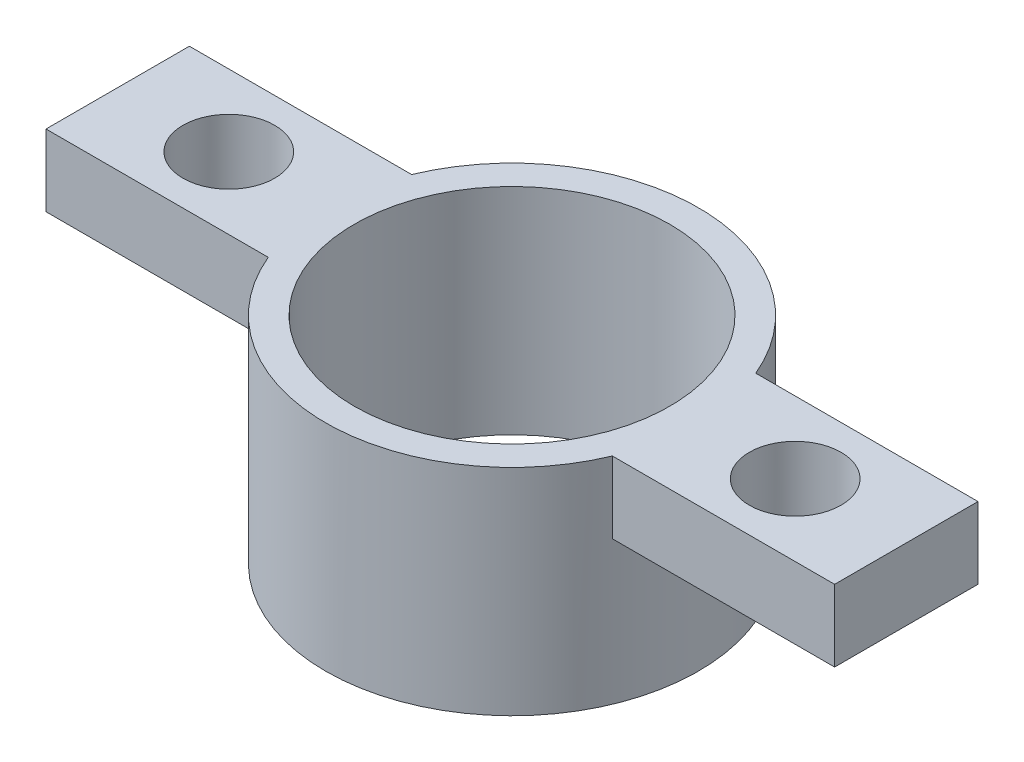
ISO-10303-21;
HEADER;
FILE_DESCRIPTION(('STEP AP214'),'2;1');
FILE_NAME('part.step','',(''),(''),'','','');
FILE_SCHEMA(('AUTOMOTIVE_DESIGN { 1 0 10303 214 1 1 1 1 }'));
ENDSEC;
DATA;
#1=APPLICATION_CONTEXT('core data for automotive mechanical design processes');
#2=APPLICATION_PROTOCOL_DEFINITION('international standard','automotive_design',2000,#1);
#3=PRODUCT_CONTEXT('',#1,'mechanical');
#4=PRODUCT('Part','Part','',(#3));
#5=PRODUCT_RELATED_PRODUCT_CATEGORY('part','',(#4));
#6=PRODUCT_DEFINITION_FORMATION('','',#4);
#7=PRODUCT_DEFINITION_CONTEXT('part definition',#1,'design');
#8=PRODUCT_DEFINITION('design','',#6,#7);
#9=PRODUCT_DEFINITION_SHAPE('','',#8);
#10=(LENGTH_UNIT() NAMED_UNIT(*) SI_UNIT(.MILLI.,.METRE.));
#11=(NAMED_UNIT(*) PLANE_ANGLE_UNIT() SI_UNIT($,.RADIAN.));
#12=(NAMED_UNIT(*) SI_UNIT($,.STERADIAN.) SOLID_ANGLE_UNIT());
#13=UNCERTAINTY_MEASURE_WITH_UNIT(LENGTH_MEASURE(1.E-05),#10,'distance_accuracy_value','');
#14=(GEOMETRIC_REPRESENTATION_CONTEXT(3) GLOBAL_UNCERTAINTY_ASSIGNED_CONTEXT((#13)) GLOBAL_UNIT_ASSIGNED_CONTEXT((#10,
#11,#12)) REPRESENTATION_CONTEXT('',''));
#15=CARTESIAN_POINT('',(0.,0.,0.));
#16=DIRECTION('',(0.,0.,1.));
#17=DIRECTION('',(1.,0.,0.));
#18=AXIS2_PLACEMENT_3D('',#15,#16,#17);
#19=CARTESIAN_POINT('',(0.,7.5,0.));
#20=DIRECTION('',(0.,1.,0.));
#21=DIRECTION('',(0.,0.,1.));
#22=AXIS2_PLACEMENT_3D('',#19,#20,#21);
#23=PLANE('',#22);
#24=CARTESIAN_POINT('',(9.875,7.5,0.));
#25=DIRECTION('',(0.,1.,0.));
#26=DIRECTION('',(0.,0.,1.));
#27=AXIS2_PLACEMENT_3D('',#24,#25,#26);
#28=CIRCLE('',#27,1.59999999999999);
#29=CARTESIAN_POINT('',(9.875,7.5,1.59999999999999));
#30=VERTEX_POINT('',#29);
#31=EDGE_CURVE('E43',#30,#30,#28,.T.);
#32=ORIENTED_EDGE('',*,*,#31,.F.);
#33=EDGE_LOOP('',(#32));
#34=FACE_BOUND('',#33,.T.);
#35=CARTESIAN_POINT('',(-9.875,7.5,0.));
#36=DIRECTION('',(0.,1.,0.));
#37=DIRECTION('',(0.,0.,1.));
#38=AXIS2_PLACEMENT_3D('',#35,#36,#37);
#39=CIRCLE('',#38,1.59999999999999);
#40=CARTESIAN_POINT('',(-9.875,7.5,1.59999999999999));
#41=VERTEX_POINT('',#40);
#42=EDGE_CURVE('E357',#41,#41,#39,.T.);
#43=ORIENTED_EDGE('',*,*,#42,.F.);
#44=EDGE_LOOP('',(#43));
#45=FACE_BOUND('',#44,.T.);
#46=CARTESIAN_POINT('',(0.,7.5,0.));
#47=DIRECTION('',(0.,1.,0.));
#48=DIRECTION('',(0.,0.,1.));
#49=AXIS2_PLACEMENT_3D('',#46,#47,#48);
#50=CIRCLE('',#49,6.5);
#51=CARTESIAN_POINT('',(6.,7.5,-2.5));
#52=VERTEX_POINT('',#51);
#53=CARTESIAN_POINT('',(-6.,7.5,-2.5));
#54=VERTEX_POINT('',#53);
#55=EDGE_CURVE('E11',#52,#54,#50,.T.);
#56=ORIENTED_EDGE('',*,*,#55,.T.);
#57=DIRECTION('',(-1.,0.,0.));
#58=VECTOR('',#57,1.);
#59=CARTESIAN_POINT('',(-13.75,7.5,-2.5));
#60=LINE('',#59,#58);
#61=CARTESIAN_POINT('',(-13.75,7.5,-2.5));
#62=VERTEX_POINT('',#61);
#63=EDGE_CURVE('E365',#54,#62,#60,.T.);
#64=ORIENTED_EDGE('',*,*,#63,.T.);
#65=DIRECTION('',(0.,0.,1.));
#66=VECTOR('',#65,1.);
#67=CARTESIAN_POINT('',(-13.75,7.5,2.5));
#68=LINE('',#67,#66);
#69=CARTESIAN_POINT('',(-13.75,7.5,2.5));
#70=VERTEX_POINT('',#69);
#71=EDGE_CURVE('E128',#62,#70,#68,.T.);
#72=ORIENTED_EDGE('',*,*,#71,.T.);
#73=DIRECTION('',(1.,0.,0.));
#74=VECTOR('',#73,1.);
#75=CARTESIAN_POINT('',(-13.75,7.5,2.5));
#76=LINE('',#75,#74);
#77=CARTESIAN_POINT('',(-6.,7.5,2.5));
#78=VERTEX_POINT('',#77);
#79=EDGE_CURVE('E57',#70,#78,#76,.T.);
#80=ORIENTED_EDGE('',*,*,#79,.T.);
#81=CARTESIAN_POINT('',(6.,7.5,2.5));
#82=VERTEX_POINT('',#81);
#83=EDGE_CURVE('E49',#78,#82,#50,.T.);
#84=ORIENTED_EDGE('',*,*,#83,.T.);
#85=DIRECTION('',(1.,0.,0.));
#86=VECTOR('',#85,1.);
#87=CARTESIAN_POINT('',(6.,7.5,2.5));
#88=LINE('',#87,#86);
#89=CARTESIAN_POINT('',(13.75,7.5,2.5));
#90=VERTEX_POINT('',#89);
#91=EDGE_CURVE('E163',#82,#90,#88,.T.);
#92=ORIENTED_EDGE('',*,*,#91,.T.);
#93=DIRECTION('',(0.,0.,-1.));
#94=VECTOR('',#93,1.);
#95=CARTESIAN_POINT('',(13.75,7.5,2.5));
#96=LINE('',#95,#94);
#97=CARTESIAN_POINT('',(13.75,7.5,-2.5));
#98=VERTEX_POINT('',#97);
#99=EDGE_CURVE('E148',#90,#98,#96,.T.);
#100=ORIENTED_EDGE('',*,*,#99,.T.);
#101=DIRECTION('',(-1.,0.,0.));
#102=VECTOR('',#101,1.);
#103=CARTESIAN_POINT('',(6.,7.5,-2.5));
#104=LINE('',#103,#102);
#105=EDGE_CURVE('E63',#98,#52,#104,.T.);
#106=ORIENTED_EDGE('',*,*,#105,.T.);
#107=EDGE_LOOP('',(#56,#64,#72,#80,#84,#92,#100,#106));
#108=FACE_BOUND('',#107,.T.);
#109=CARTESIAN_POINT('',(0.,7.5,0.));
#110=DIRECTION('',(0.,1.,0.));
#111=DIRECTION('',(0.,0.,1.));
#112=AXIS2_PLACEMENT_3D('',#109,#110,#111);
#113=CIRCLE('',#112,5.5);
#114=CARTESIAN_POINT('',(0.,7.5,5.5));
#115=VERTEX_POINT('',#114);
#116=EDGE_CURVE('E181',#115,#115,#113,.T.);
#117=ORIENTED_EDGE('',*,*,#116,.F.);
#118=EDGE_LOOP('',(#117));
#119=FACE_BOUND('',#118,.T.);
#120=ADVANCED_FACE('F39',(#34,#45,#108,#119),#23,.T.);
#121=CARTESIAN_POINT('',(0.,0.,0.));
#122=DIRECTION('',(0.,1.,0.));
#123=DIRECTION('',(0.,0.,1.));
#124=AXIS2_PLACEMENT_3D('',#121,#122,#123);
#125=PLANE('',#124);
#126=CARTESIAN_POINT('',(0.,0.,0.));
#127=DIRECTION('',(0.,1.,0.));
#128=DIRECTION('',(0.,0.,1.));
#129=AXIS2_PLACEMENT_3D('',#126,#127,#128);
#130=CIRCLE('',#129,6.5);
#131=CARTESIAN_POINT('',(0.,0.,6.5));
#132=VERTEX_POINT('',#131);
#133=EDGE_CURVE('E185',#132,#132,#130,.T.);
#134=ORIENTED_EDGE('',*,*,#133,.F.);
#135=EDGE_LOOP('',(#134));
#136=FACE_BOUND('',#135,.T.);
#137=CARTESIAN_POINT('',(0.,0.,0.));
#138=DIRECTION('',(0.,1.,0.));
#139=DIRECTION('',(0.,0.,1.));
#140=AXIS2_PLACEMENT_3D('',#137,#138,#139);
#141=CIRCLE('',#140,5.5);
#142=CARTESIAN_POINT('',(0.,0.,5.5));
#143=VERTEX_POINT('',#142);
#144=EDGE_CURVE('E172',#143,#143,#141,.T.);
#145=ORIENTED_EDGE('',*,*,#144,.T.);
#146=EDGE_LOOP('',(#145));
#147=FACE_BOUND('',#146,.T.);
#148=ADVANCED_FACE('F219',(#136,#147),#125,.F.);
#149=CARTESIAN_POINT('',(0.,7.5,0.));
#150=DIRECTION('',(0.,-1.,0.));
#151=DIRECTION('',(0.,0.,-1.));
#152=AXIS2_PLACEMENT_3D('',#149,#150,#151);
#153=CYLINDRICAL_SURFACE('',#152,6.5);
#154=ORIENTED_EDGE('',*,*,#83,.F.);
#155=DIRECTION('',(0.,1.,0.));
#156=VECTOR('',#155,1.);
#157=CARTESIAN_POINT('',(-6.,5.,2.5));
#158=LINE('',#157,#156);
#159=CARTESIAN_POINT('',(-6.,5.,2.5));
#160=VERTEX_POINT('',#159);
#161=EDGE_CURVE('E124',#160,#78,#158,.T.);
#162=ORIENTED_EDGE('',*,*,#161,.F.);
#163=CARTESIAN_POINT('',(0.,5.,0.));
#164=DIRECTION('',(0.,-1.,0.));
#165=DIRECTION('',(0.,0.,-1.));
#166=AXIS2_PLACEMENT_3D('',#163,#164,#165);
#167=CIRCLE('',#166,6.5);
#168=CARTESIAN_POINT('',(-6.,5.,-2.5));
#169=VERTEX_POINT('',#168);
#170=EDGE_CURVE('E109',#160,#169,#167,.T.);
#171=ORIENTED_EDGE('',*,*,#170,.T.);
#172=DIRECTION('',(0.,1.,0.));
#173=VECTOR('',#172,1.);
#174=CARTESIAN_POINT('',(-6.,5.,-2.5));
#175=LINE('',#174,#173);
#176=EDGE_CURVE('E133',#169,#54,#175,.T.);
#177=ORIENTED_EDGE('',*,*,#176,.T.);
#178=ORIENTED_EDGE('',*,*,#55,.F.);
#179=DIRECTION('',(0.,1.,0.));
#180=VECTOR('',#179,1.);
#181=CARTESIAN_POINT('',(6.,5.,-2.5));
#182=LINE('',#181,#180);
#183=CARTESIAN_POINT('',(6.,5.,-2.5));
#184=VERTEX_POINT('',#183);
#185=EDGE_CURVE('E160',#184,#52,#182,.T.);
#186=ORIENTED_EDGE('',*,*,#185,.F.);
#187=CARTESIAN_POINT('',(0.,5.,0.));
#188=DIRECTION('',(0.,-1.,0.));
#189=DIRECTION('',(0.,0.,-1.));
#190=AXIS2_PLACEMENT_3D('',#187,#188,#189);
#191=CIRCLE('',#190,6.5);
#192=CARTESIAN_POINT('',(6.,5.,2.5));
#193=VERTEX_POINT('',#192);
#194=EDGE_CURVE('E147',#184,#193,#191,.T.);
#195=ORIENTED_EDGE('',*,*,#194,.T.);
#196=DIRECTION('',(0.,1.,0.));
#197=VECTOR('',#196,1.);
#198=CARTESIAN_POINT('',(6.,5.,2.5));
#199=LINE('',#198,#197);
#200=EDGE_CURVE('E176',#193,#82,#199,.T.);
#201=ORIENTED_EDGE('',*,*,#200,.T.);
#202=EDGE_LOOP('',(#154,#162,#171,#177,#178,#186,#195,#201));
#203=FACE_BOUND('',#202,.T.);
#204=ORIENTED_EDGE('',*,*,#133,.T.);
#205=EDGE_LOOP('',(#204));
#206=FACE_BOUND('',#205,.T.);
#207=ADVANCED_FACE('F41',(#203,#206),#153,.T.);
#208=CARTESIAN_POINT('',(0.,7.5,0.));
#209=DIRECTION('',(0.,-1.,0.));
#210=DIRECTION('',(0.,0.,-1.));
#211=AXIS2_PLACEMENT_3D('',#208,#209,#210);
#212=CYLINDRICAL_SURFACE('',#211,5.5);
#213=ORIENTED_EDGE('',*,*,#116,.T.);
#214=EDGE_LOOP('',(#213));
#215=FACE_BOUND('',#214,.T.);
#216=ORIENTED_EDGE('',*,*,#144,.F.);
#217=EDGE_LOOP('',(#216));
#218=FACE_BOUND('',#217,.T.);
#219=ADVANCED_FACE('F215',(#215,#218),#212,.F.);
#220=CARTESIAN_POINT('',(6.,5.,-2.5));
#221=DIRECTION('',(0.,0.,-1.));
#222=DIRECTION('',(-1.,0.,0.));
#223=AXIS2_PLACEMENT_3D('',#220,#221,#222);
#224=PLANE('',#223);
#225=ORIENTED_EDGE('',*,*,#105,.F.);
#226=DIRECTION('',(0.,1.,0.));
#227=VECTOR('',#226,1.);
#228=CARTESIAN_POINT('',(13.75,5.,-2.5));
#229=LINE('',#228,#227);
#230=CARTESIAN_POINT('',(13.75,5.,-2.5));
#231=VERTEX_POINT('',#230);
#232=EDGE_CURVE('E169',#231,#98,#229,.T.);
#233=ORIENTED_EDGE('',*,*,#232,.F.);
#234=DIRECTION('',(-1.,0.,0.));
#235=VECTOR('',#234,1.);
#236=CARTESIAN_POINT('',(6.,5.,-2.5));
#237=LINE('',#236,#235);
#238=EDGE_CURVE('E143',#231,#184,#237,.T.);
#239=ORIENTED_EDGE('',*,*,#238,.T.);
#240=ORIENTED_EDGE('',*,*,#185,.T.);
#241=EDGE_LOOP('',(#225,#233,#239,#240));
#242=FACE_BOUND('',#241,.T.);
#243=ADVANCED_FACE('F205',(#242),#224,.T.);
#244=CARTESIAN_POINT('',(13.75,5.,2.5));
#245=DIRECTION('',(1.,0.,0.));
#246=DIRECTION('',(0.,0.,-1.));
#247=AXIS2_PLACEMENT_3D('',#244,#245,#246);
#248=PLANE('',#247);
#249=ORIENTED_EDGE('',*,*,#99,.F.);
#250=DIRECTION('',(0.,1.,0.));
#251=VECTOR('',#250,1.);
#252=CARTESIAN_POINT('',(13.75,5.,2.5));
#253=LINE('',#252,#251);
#254=CARTESIAN_POINT('',(13.75,5.,2.5));
#255=VERTEX_POINT('',#254);
#256=EDGE_CURVE('E173',#255,#90,#253,.T.);
#257=ORIENTED_EDGE('',*,*,#256,.F.);
#258=DIRECTION('',(0.,0.,-1.));
#259=VECTOR('',#258,1.);
#260=CARTESIAN_POINT('',(13.75,5.,2.5));
#261=LINE('',#260,#259);
#262=EDGE_CURVE('E156',#255,#231,#261,.T.);
#263=ORIENTED_EDGE('',*,*,#262,.T.);
#264=ORIENTED_EDGE('',*,*,#232,.T.);
#265=EDGE_LOOP('',(#249,#257,#263,#264));
#266=FACE_BOUND('',#265,.T.);
#267=ADVANCED_FACE('F207',(#266),#248,.T.);
#268=CARTESIAN_POINT('',(6.,5.,2.5));
#269=DIRECTION('',(0.,0.,1.));
#270=DIRECTION('',(1.,0.,0.));
#271=AXIS2_PLACEMENT_3D('',#268,#269,#270);
#272=PLANE('',#271);
#273=ORIENTED_EDGE('',*,*,#91,.F.);
#274=ORIENTED_EDGE('',*,*,#200,.F.);
#275=DIRECTION('',(1.,0.,0.));
#276=VECTOR('',#275,1.);
#277=CARTESIAN_POINT('',(6.,5.,2.5));
#278=LINE('',#277,#276);
#279=EDGE_CURVE('E152',#193,#255,#278,.T.);
#280=ORIENTED_EDGE('',*,*,#279,.T.);
#281=ORIENTED_EDGE('',*,*,#256,.T.);
#282=EDGE_LOOP('',(#273,#274,#280,#281));
#283=FACE_BOUND('',#282,.T.);
#284=ADVANCED_FACE('F196',(#283),#272,.T.);
#285=CARTESIAN_POINT('',(0.,5.,0.));
#286=DIRECTION('',(0.,-1.,0.));
#287=DIRECTION('',(0.,0.,-1.));
#288=AXIS2_PLACEMENT_3D('',#285,#286,#287);
#289=PLANE('',#288);
#290=CARTESIAN_POINT('',(9.875,5.,0.));
#291=DIRECTION('',(0.,-1.,0.));
#292=DIRECTION('',(0.,0.,-1.));
#293=AXIS2_PLACEMENT_3D('',#290,#291,#292);
#294=CIRCLE('',#293,1.59999999999999);
#295=CARTESIAN_POINT('',(9.875,5.,-1.59999999999999));
#296=VERTEX_POINT('',#295);
#297=EDGE_CURVE('E348',#296,#296,#294,.T.);
#298=ORIENTED_EDGE('',*,*,#297,.F.);
#299=EDGE_LOOP('',(#298));
#300=FACE_BOUND('',#299,.T.);
#301=ORIENTED_EDGE('',*,*,#238,.F.);
#302=ORIENTED_EDGE('',*,*,#262,.F.);
#303=ORIENTED_EDGE('',*,*,#279,.F.);
#304=ORIENTED_EDGE('',*,*,#194,.F.);
#305=EDGE_LOOP('',(#301,#302,#303,#304));
#306=FACE_BOUND('',#305,.T.);
#307=ADVANCED_FACE('F202',(#300,#306),#289,.T.);
#308=CARTESIAN_POINT('',(-13.75,5.,2.5));
#309=DIRECTION('',(0.,0.,1.));
#310=DIRECTION('',(1.,0.,0.));
#311=AXIS2_PLACEMENT_3D('',#308,#309,#310);
#312=PLANE('',#311);
#313=ORIENTED_EDGE('',*,*,#79,.F.);
#314=DIRECTION('',(0.,1.,0.));
#315=VECTOR('',#314,1.);
#316=CARTESIAN_POINT('',(-13.75,5.,2.5));
#317=LINE('',#316,#315);
#318=CARTESIAN_POINT('',(-13.75,5.,2.5));
#319=VERTEX_POINT('',#318);
#320=EDGE_CURVE('E126',#319,#70,#317,.T.);
#321=ORIENTED_EDGE('',*,*,#320,.F.);
#322=DIRECTION('',(1.,0.,0.));
#323=VECTOR('',#322,1.);
#324=CARTESIAN_POINT('',(-13.75,5.,2.5));
#325=LINE('',#324,#323);
#326=EDGE_CURVE('E113',#319,#160,#325,.T.);
#327=ORIENTED_EDGE('',*,*,#326,.T.);
#328=ORIENTED_EDGE('',*,*,#161,.T.);
#329=EDGE_LOOP('',(#313,#321,#327,#328));
#330=FACE_BOUND('',#329,.T.);
#331=ADVANCED_FACE('F123',(#330),#312,.T.);
#332=CARTESIAN_POINT('',(-13.75,5.,2.5));
#333=DIRECTION('',(-1.,0.,0.));
#334=DIRECTION('',(0.,0.,1.));
#335=AXIS2_PLACEMENT_3D('',#332,#333,#334);
#336=PLANE('',#335);
#337=ORIENTED_EDGE('',*,*,#71,.F.);
#338=DIRECTION('',(0.,1.,0.));
#339=VECTOR('',#338,1.);
#340=CARTESIAN_POINT('',(-13.75,5.,-2.5));
#341=LINE('',#340,#339);
#342=CARTESIAN_POINT('',(-13.75,5.,-2.5));
#343=VERTEX_POINT('',#342);
#344=EDGE_CURVE('E138',#343,#62,#341,.T.);
#345=ORIENTED_EDGE('',*,*,#344,.F.);
#346=DIRECTION('',(0.,0.,1.));
#347=VECTOR('',#346,1.);
#348=CARTESIAN_POINT('',(-13.75,5.,2.5));
#349=LINE('',#348,#347);
#350=EDGE_CURVE('E134',#343,#319,#349,.T.);
#351=ORIENTED_EDGE('',*,*,#350,.T.);
#352=ORIENTED_EDGE('',*,*,#320,.T.);
#353=EDGE_LOOP('',(#337,#345,#351,#352));
#354=FACE_BOUND('',#353,.T.);
#355=ADVANCED_FACE('F293',(#354),#336,.T.);
#356=CARTESIAN_POINT('',(-13.75,5.,-2.5));
#357=DIRECTION('',(0.,0.,-1.));
#358=DIRECTION('',(-1.,0.,0.));
#359=AXIS2_PLACEMENT_3D('',#356,#357,#358);
#360=PLANE('',#359);
#361=ORIENTED_EDGE('',*,*,#63,.F.);
#362=ORIENTED_EDGE('',*,*,#176,.F.);
#363=DIRECTION('',(-1.,0.,0.));
#364=VECTOR('',#363,1.);
#365=CARTESIAN_POINT('',(-13.75,5.,-2.5));
#366=LINE('',#365,#364);
#367=EDGE_CURVE('E116',#169,#343,#366,.T.);
#368=ORIENTED_EDGE('',*,*,#367,.T.);
#369=ORIENTED_EDGE('',*,*,#344,.T.);
#370=EDGE_LOOP('',(#361,#362,#368,#369));
#371=FACE_BOUND('',#370,.T.);
#372=ADVANCED_FACE('F301',(#371),#360,.T.);
#373=CARTESIAN_POINT('',(0.,5.,0.));
#374=DIRECTION('',(0.,-1.,0.));
#375=DIRECTION('',(0.,0.,-1.));
#376=AXIS2_PLACEMENT_3D('',#373,#374,#375);
#377=PLANE('',#376);
#378=CARTESIAN_POINT('',(-9.875,5.,0.));
#379=DIRECTION('',(0.,-1.,0.));
#380=DIRECTION('',(0.,0.,-1.));
#381=AXIS2_PLACEMENT_3D('',#378,#379,#380);
#382=CIRCLE('',#381,1.59999999999999);
#383=CARTESIAN_POINT('',(-9.875,5.,-1.59999999999999));
#384=VERTEX_POINT('',#383);
#385=EDGE_CURVE('E352',#384,#384,#382,.T.);
#386=ORIENTED_EDGE('',*,*,#385,.F.);
#387=EDGE_LOOP('',(#386));
#388=FACE_BOUND('',#387,.T.);
#389=ORIENTED_EDGE('',*,*,#326,.F.);
#390=ORIENTED_EDGE('',*,*,#350,.F.);
#391=ORIENTED_EDGE('',*,*,#367,.F.);
#392=ORIENTED_EDGE('',*,*,#170,.F.);
#393=EDGE_LOOP('',(#389,#390,#391,#392));
#394=FACE_BOUND('',#393,.T.);
#395=ADVANCED_FACE('F111',(#388,#394),#377,.T.);
#396=CARTESIAN_POINT('',(-9.875,5.,0.));
#397=DIRECTION('',(0.,-1.,0.));
#398=DIRECTION('',(0.,0.,-1.));
#399=AXIS2_PLACEMENT_3D('',#396,#397,#398);
#400=CYLINDRICAL_SURFACE('',#399,1.59999999999999);
#401=ORIENTED_EDGE('',*,*,#42,.T.);
#402=EDGE_LOOP('',(#401));
#403=FACE_BOUND('',#402,.T.);
#404=ORIENTED_EDGE('',*,*,#385,.T.);
#405=EDGE_LOOP('',(#404));
#406=FACE_BOUND('',#405,.T.);
#407=ADVANCED_FACE('F316',(#403,#406),#400,.F.);
#408=CARTESIAN_POINT('',(9.875,5.,0.));
#409=DIRECTION('',(0.,-1.,0.));
#410=DIRECTION('',(0.,0.,-1.));
#411=AXIS2_PLACEMENT_3D('',#408,#409,#410);
#412=CYLINDRICAL_SURFACE('',#411,1.59999999999999);
#413=ORIENTED_EDGE('',*,*,#31,.T.);
#414=EDGE_LOOP('',(#413));
#415=FACE_BOUND('',#414,.T.);
#416=ORIENTED_EDGE('',*,*,#297,.T.);
#417=EDGE_LOOP('',(#416));
#418=FACE_BOUND('',#417,.T.);
#419=ADVANCED_FACE('F325',(#415,#418),#412,.F.);
#420=CLOSED_SHELL('',(#120,#148,#207,#219,#243,#267,#284,#307,#331,#355,#372,#395,#407,#419));
#421=MANIFOLD_SOLID_BREP('B2',#420);
#422=ADVANCED_BREP_SHAPE_REPRESENTATION('',(#18,#421),#14);
#423=SHAPE_DEFINITION_REPRESENTATION(#9,#422);
ENDSEC;
END-ISO-10303-21;
